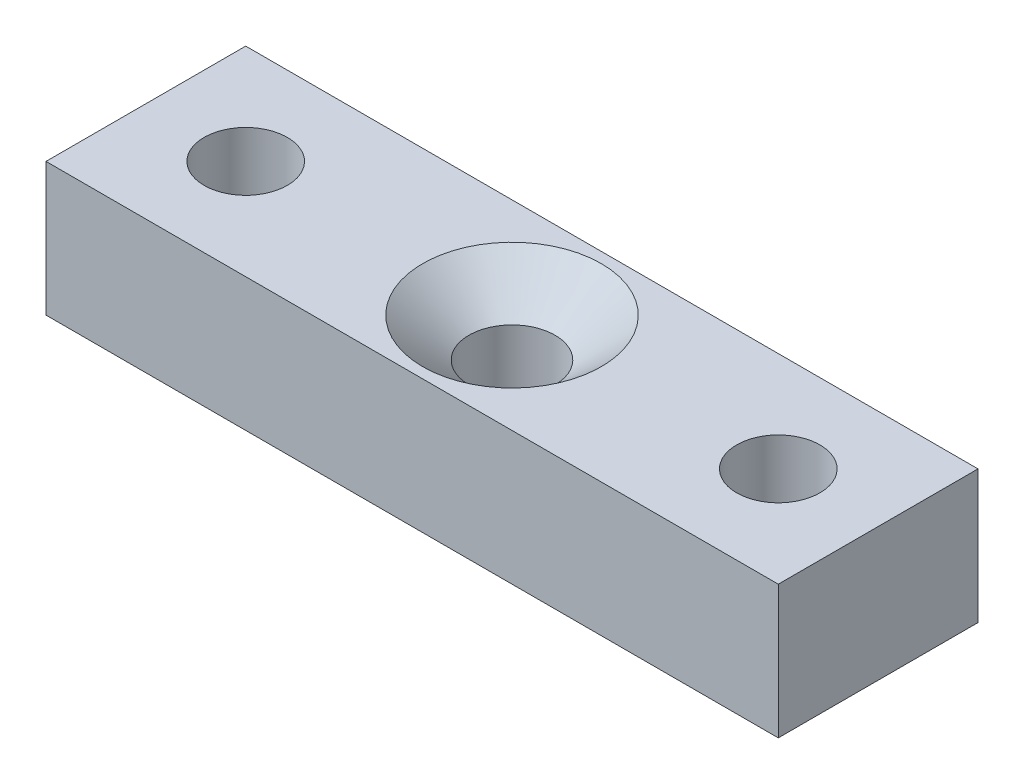
ISO-10303-21;
HEADER;
FILE_DESCRIPTION(('STEP AP214'),'2;1');
FILE_NAME('part.step','',(''),(''),'','','');
FILE_SCHEMA(('AUTOMOTIVE_DESIGN { 1 0 10303 214 1 1 1 1 }'));
ENDSEC;
DATA;
#1=APPLICATION_CONTEXT('core data for automotive mechanical design processes');
#2=APPLICATION_PROTOCOL_DEFINITION('international standard','automotive_design',2000,#1);
#3=PRODUCT_CONTEXT('',#1,'mechanical');
#4=PRODUCT('Part','Part','',(#3));
#5=PRODUCT_RELATED_PRODUCT_CATEGORY('part','',(#4));
#6=PRODUCT_DEFINITION_FORMATION('','',#4);
#7=PRODUCT_DEFINITION_CONTEXT('part definition',#1,'design');
#8=PRODUCT_DEFINITION('design','',#6,#7);
#9=PRODUCT_DEFINITION_SHAPE('','',#8);
#10=(LENGTH_UNIT() NAMED_UNIT(*) SI_UNIT(.MILLI.,.METRE.));
#11=(NAMED_UNIT(*) PLANE_ANGLE_UNIT() SI_UNIT($,.RADIAN.));
#12=(NAMED_UNIT(*) SI_UNIT($,.STERADIAN.) SOLID_ANGLE_UNIT());
#13=UNCERTAINTY_MEASURE_WITH_UNIT(LENGTH_MEASURE(1.E-05),#10,'distance_accuracy_value','');
#14=(GEOMETRIC_REPRESENTATION_CONTEXT(3) GLOBAL_UNCERTAINTY_ASSIGNED_CONTEXT((#13)) GLOBAL_UNIT_ASSIGNED_CONTEXT((#10,
#11,#12)) REPRESENTATION_CONTEXT('',''));
#15=CARTESIAN_POINT('',(0.,0.,0.));
#16=DIRECTION('',(0.,0.,1.));
#17=DIRECTION('',(1.,0.,0.));
#18=AXIS2_PLACEMENT_3D('',#15,#16,#17);
#19=CARTESIAN_POINT('',(34.925,-6.35,19.05));
#20=DIRECTION('',(-1.,0.,0.));
#21=DIRECTION('',(0.,0.,1.));
#22=AXIS2_PLACEMENT_3D('',#19,#20,#21);
#23=PLANE('',#22);
#24=DIRECTION('',(0.,1.,0.));
#25=VECTOR('',#24,1.);
#26=CARTESIAN_POINT('',(34.925,-6.35,0.));
#27=LINE('',#26,#25);
#28=CARTESIAN_POINT('',(34.925,-6.35,0.));
#29=VERTEX_POINT('',#28);
#30=CARTESIAN_POINT('',(34.925,6.35,0.));
#31=VERTEX_POINT('',#30);
#32=EDGE_CURVE('E98',#29,#31,#27,.T.);
#33=ORIENTED_EDGE('',*,*,#32,.T.);
#34=DIRECTION('',(0.,0.,-1.));
#35=VECTOR('',#34,1.);
#36=CARTESIAN_POINT('',(34.925,6.35,19.05));
#37=LINE('',#36,#35);
#38=CARTESIAN_POINT('',(34.925,6.35,19.05));
#39=VERTEX_POINT('',#38);
#40=EDGE_CURVE('E11',#39,#31,#37,.T.);
#41=ORIENTED_EDGE('',*,*,#40,.F.);
#42=DIRECTION('',(0.,1.,0.));
#43=VECTOR('',#42,1.);
#44=CARTESIAN_POINT('',(34.925,-6.35,19.05));
#45=LINE('',#44,#43);
#46=CARTESIAN_POINT('',(34.925,-6.35,19.05));
#47=VERTEX_POINT('',#46);
#48=EDGE_CURVE('E86',#47,#39,#45,.T.);
#49=ORIENTED_EDGE('',*,*,#48,.F.);
#50=DIRECTION('',(0.,0.,-1.));
#51=VECTOR('',#50,1.);
#52=CARTESIAN_POINT('',(34.925,-6.35,19.05));
#53=LINE('',#52,#51);
#54=EDGE_CURVE('E94',#47,#29,#53,.T.);
#55=ORIENTED_EDGE('',*,*,#54,.T.);
#56=EDGE_LOOP('',(#33,#41,#49,#55));
#57=FACE_BOUND('',#56,.T.);
#58=ADVANCED_FACE('F35',(#57),#23,.F.);
#59=CARTESIAN_POINT('',(-34.925,6.35,19.05));
#60=DIRECTION('',(0.,-1.,0.));
#61=DIRECTION('',(0.,0.,-1.));
#62=AXIS2_PLACEMENT_3D('',#59,#60,#61);
#63=PLANE('',#62);
#64=CARTESIAN_POINT('',(0.,6.35,9.525));
#65=DIRECTION('',(0.,1.,0.));
#66=DIRECTION('',(0.,0.,1.));
#67=AXIS2_PLACEMENT_3D('',#64,#65,#66);
#68=CIRCLE('',#67,8.5185631);
#69=CARTESIAN_POINT('',(0.,6.35,18.0435631));
#70=VERTEX_POINT('',#69);
#71=EDGE_CURVE('E129',#70,#70,#68,.T.);
#72=ORIENTED_EDGE('',*,*,#71,.F.);
#73=EDGE_LOOP('',(#72));
#74=FACE_BOUND('',#73,.T.);
#75=CARTESIAN_POINT('',(-25.4,6.35,9.525));
#76=DIRECTION('',(0.,1.,0.));
#77=DIRECTION('',(0.,0.,1.));
#78=AXIS2_PLACEMENT_3D('',#75,#76,#77);
#79=CIRCLE('',#78,3.96875);
#80=CARTESIAN_POINT('',(-25.4,6.35,13.49375));
#81=VERTEX_POINT('',#80);
#82=EDGE_CURVE('E120',#81,#81,#79,.T.);
#83=ORIENTED_EDGE('',*,*,#82,.F.);
#84=EDGE_LOOP('',(#83));
#85=FACE_BOUND('',#84,.T.);
#86=CARTESIAN_POINT('',(25.4,6.35,9.525));
#87=DIRECTION('',(0.,1.,0.));
#88=DIRECTION('',(0.,0.,1.));
#89=AXIS2_PLACEMENT_3D('',#86,#87,#88);
#90=CIRCLE('',#89,3.96875);
#91=CARTESIAN_POINT('',(25.4,6.35,13.49375));
#92=VERTEX_POINT('',#91);
#93=EDGE_CURVE('E114',#92,#92,#90,.T.);
#94=ORIENTED_EDGE('',*,*,#93,.F.);
#95=EDGE_LOOP('',(#94));
#96=FACE_BOUND('',#95,.T.);
#97=DIRECTION('',(-1.,0.,0.));
#98=VECTOR('',#97,1.);
#99=CARTESIAN_POINT('',(-34.925,6.35,0.));
#100=LINE('',#99,#98);
#101=CARTESIAN_POINT('',(-34.925,6.35,0.));
#102=VERTEX_POINT('',#101);
#103=EDGE_CURVE('E90',#31,#102,#100,.T.);
#104=ORIENTED_EDGE('',*,*,#103,.T.);
#105=DIRECTION('',(0.,0.,-1.));
#106=VECTOR('',#105,1.);
#107=CARTESIAN_POINT('',(-34.925,6.35,19.05));
#108=LINE('',#107,#106);
#109=CARTESIAN_POINT('',(-34.925,6.35,19.05));
#110=VERTEX_POINT('',#109);
#111=EDGE_CURVE('E43',#110,#102,#108,.T.);
#112=ORIENTED_EDGE('',*,*,#111,.F.);
#113=DIRECTION('',(-1.,0.,0.));
#114=VECTOR('',#113,1.);
#115=CARTESIAN_POINT('',(-34.925,6.35,19.05));
#116=LINE('',#115,#114);
#117=EDGE_CURVE('E81',#39,#110,#116,.T.);
#118=ORIENTED_EDGE('',*,*,#117,.F.);
#119=ORIENTED_EDGE('',*,*,#40,.T.);
#120=EDGE_LOOP('',(#104,#112,#118,#119));
#121=FACE_BOUND('',#120,.T.);
#122=ADVANCED_FACE('F89',(#74,#85,#96,#121),#63,.F.);
#123=CARTESIAN_POINT('',(-34.925,-6.35,19.05));
#124=DIRECTION('',(1.,0.,0.));
#125=DIRECTION('',(0.,0.,-1.));
#126=AXIS2_PLACEMENT_3D('',#123,#124,#125);
#127=PLANE('',#126);
#128=DIRECTION('',(0.,-1.,0.));
#129=VECTOR('',#128,1.);
#130=CARTESIAN_POINT('',(-34.925,-6.35,0.));
#131=LINE('',#130,#129);
#132=CARTESIAN_POINT('',(-34.925,-6.35,0.));
#133=VERTEX_POINT('',#132);
#134=EDGE_CURVE('E68',#102,#133,#131,.T.);
#135=ORIENTED_EDGE('',*,*,#134,.T.);
#136=DIRECTION('',(0.,0.,-1.));
#137=VECTOR('',#136,1.);
#138=CARTESIAN_POINT('',(-34.925,-6.35,19.05));
#139=LINE('',#138,#137);
#140=CARTESIAN_POINT('',(-34.925,-6.35,19.05));
#141=VERTEX_POINT('',#140);
#142=EDGE_CURVE('E91',#141,#133,#139,.T.);
#143=ORIENTED_EDGE('',*,*,#142,.F.);
#144=DIRECTION('',(0.,-1.,0.));
#145=VECTOR('',#144,1.);
#146=CARTESIAN_POINT('',(-34.925,-6.35,19.05));
#147=LINE('',#146,#145);
#148=EDGE_CURVE('E84',#110,#141,#147,.T.);
#149=ORIENTED_EDGE('',*,*,#148,.F.);
#150=ORIENTED_EDGE('',*,*,#111,.T.);
#151=EDGE_LOOP('',(#135,#143,#149,#150));
#152=FACE_BOUND('',#151,.T.);
#153=ADVANCED_FACE('F92',(#152),#127,.F.);
#154=CARTESIAN_POINT('',(-34.925,-6.35,19.05));
#155=DIRECTION('',(0.,1.,0.));
#156=DIRECTION('',(0.,0.,1.));
#157=AXIS2_PLACEMENT_3D('',#154,#155,#156);
#158=PLANE('',#157);
#159=CARTESIAN_POINT('',(0.,-6.35,9.525));
#160=DIRECTION('',(0.,1.,0.));
#161=DIRECTION('',(0.,0.,1.));
#162=AXIS2_PLACEMENT_3D('',#159,#160,#161);
#163=CIRCLE('',#162,4.1021);
#164=CARTESIAN_POINT('',(0.,-6.35,13.6271));
#165=VERTEX_POINT('',#164);
#166=EDGE_CURVE('E123',#165,#165,#163,.T.);
#167=ORIENTED_EDGE('',*,*,#166,.T.);
#168=EDGE_LOOP('',(#167));
#169=FACE_BOUND('',#168,.T.);
#170=CARTESIAN_POINT('',(-25.4,-6.35,9.525));
#171=DIRECTION('',(0.,1.,0.));
#172=DIRECTION('',(0.,0.,1.));
#173=AXIS2_PLACEMENT_3D('',#170,#171,#172);
#174=CIRCLE('',#173,3.96875);
#175=CARTESIAN_POINT('',(-25.4,-6.35,13.49375));
#176=VERTEX_POINT('',#175);
#177=EDGE_CURVE('E117',#176,#176,#174,.T.);
#178=ORIENTED_EDGE('',*,*,#177,.T.);
#179=EDGE_LOOP('',(#178));
#180=FACE_BOUND('',#179,.T.);
#181=CARTESIAN_POINT('',(25.4,-6.35,9.525));
#182=DIRECTION('',(0.,1.,0.));
#183=DIRECTION('',(0.,0.,1.));
#184=AXIS2_PLACEMENT_3D('',#181,#182,#183);
#185=CIRCLE('',#184,3.96875);
#186=CARTESIAN_POINT('',(25.4,-6.35,13.49375));
#187=VERTEX_POINT('',#186);
#188=EDGE_CURVE('E101',#187,#187,#185,.T.);
#189=ORIENTED_EDGE('',*,*,#188,.T.);
#190=EDGE_LOOP('',(#189));
#191=FACE_BOUND('',#190,.T.);
#192=DIRECTION('',(1.,0.,0.));
#193=VECTOR('',#192,1.);
#194=CARTESIAN_POINT('',(-34.925,-6.35,0.));
#195=LINE('',#194,#193);
#196=EDGE_CURVE('E74',#133,#29,#195,.T.);
#197=ORIENTED_EDGE('',*,*,#196,.T.);
#198=ORIENTED_EDGE('',*,*,#54,.F.);
#199=DIRECTION('',(1.,0.,0.));
#200=VECTOR('',#199,1.);
#201=CARTESIAN_POINT('',(-34.925,-6.35,19.05));
#202=LINE('',#201,#200);
#203=EDGE_CURVE('E51',#141,#47,#202,.T.);
#204=ORIENTED_EDGE('',*,*,#203,.F.);
#205=ORIENTED_EDGE('',*,*,#142,.T.);
#206=EDGE_LOOP('',(#197,#198,#204,#205));
#207=FACE_BOUND('',#206,.T.);
#208=ADVANCED_FACE('F106',(#169,#180,#191,#207),#158,.F.);
#209=CARTESIAN_POINT('',(0.,0.,19.05));
#210=DIRECTION('',(0.,0.,-1.));
#211=DIRECTION('',(-1.,0.,0.));
#212=AXIS2_PLACEMENT_3D('',#209,#210,#211);
#213=PLANE('',#212);
#214=ORIENTED_EDGE('',*,*,#48,.T.);
#215=ORIENTED_EDGE('',*,*,#117,.T.);
#216=ORIENTED_EDGE('',*,*,#148,.T.);
#217=ORIENTED_EDGE('',*,*,#203,.T.);
#218=EDGE_LOOP('',(#214,#215,#216,#217));
#219=FACE_BOUND('',#218,.T.);
#220=ADVANCED_FACE('F82',(#219),#213,.F.);
#221=CARTESIAN_POINT('',(0.,0.,0.));
#222=DIRECTION('',(0.,0.,-1.));
#223=DIRECTION('',(-1.,0.,0.));
#224=AXIS2_PLACEMENT_3D('',#221,#222,#223);
#225=PLANE('',#224);
#226=ORIENTED_EDGE('',*,*,#32,.F.);
#227=ORIENTED_EDGE('',*,*,#196,.F.);
#228=ORIENTED_EDGE('',*,*,#134,.F.);
#229=ORIENTED_EDGE('',*,*,#103,.F.);
#230=EDGE_LOOP('',(#226,#227,#228,#229));
#231=FACE_BOUND('',#230,.T.);
#232=ADVANCED_FACE('F109',(#231),#225,.T.);
#233=CARTESIAN_POINT('',(25.4,6.35,9.525));
#234=DIRECTION('',(0.,1.,0.));
#235=DIRECTION('',(0.,0.,1.));
#236=AXIS2_PLACEMENT_3D('',#233,#234,#235);
#237=CYLINDRICAL_SURFACE('',#236,3.96875);
#238=ORIENTED_EDGE('',*,*,#188,.F.);
#239=EDGE_LOOP('',(#238));
#240=FACE_BOUND('',#239,.T.);
#241=ORIENTED_EDGE('',*,*,#93,.T.);
#242=EDGE_LOOP('',(#241));
#243=FACE_BOUND('',#242,.T.);
#244=ADVANCED_FACE('F141',(#240,#243),#237,.F.);
#245=CARTESIAN_POINT('',(-25.4,6.35,9.525));
#246=DIRECTION('',(0.,1.,0.));
#247=DIRECTION('',(0.,0.,1.));
#248=AXIS2_PLACEMENT_3D('',#245,#246,#247);
#249=CYLINDRICAL_SURFACE('',#248,3.96875);
#250=ORIENTED_EDGE('',*,*,#177,.F.);
#251=EDGE_LOOP('',(#250));
#252=FACE_BOUND('',#251,.T.);
#253=ORIENTED_EDGE('',*,*,#82,.T.);
#254=EDGE_LOOP('',(#253));
#255=FACE_BOUND('',#254,.T.);
#256=ADVANCED_FACE('F143',(#252,#255),#249,.F.);
#257=CARTESIAN_POINT('',(0.,6.35,9.525));
#258=DIRECTION('',(0.,1.,0.));
#259=DIRECTION('',(0.,0.,1.));
#260=AXIS2_PLACEMENT_3D('',#257,#258,#259);
#261=CYLINDRICAL_SURFACE('',#260,4.1021);
#262=ORIENTED_EDGE('',*,*,#166,.F.);
#263=EDGE_LOOP('',(#262));
#264=FACE_BOUND('',#263,.T.);
#265=CARTESIAN_POINT('',(0.,2.64414744168193,9.525));
#266=DIRECTION('',(0.,1.,0.));
#267=DIRECTION('',(0.,0.,1.));
#268=AXIS2_PLACEMENT_3D('',#265,#266,#267);
#269=CIRCLE('',#268,4.1021);
#270=CARTESIAN_POINT('',(0.,2.64414744168193,13.6271));
#271=VERTEX_POINT('',#270);
#272=EDGE_CURVE('E126',#271,#271,#269,.T.);
#273=ORIENTED_EDGE('',*,*,#272,.T.);
#274=EDGE_LOOP('',(#273));
#275=FACE_BOUND('',#274,.T.);
#276=ADVANCED_FACE('F150',(#264,#275),#261,.F.);
#277=CARTESIAN_POINT('',(0.,6.35,9.525));
#278=DIRECTION('',(0.,1.,0.));
#279=DIRECTION('',(0.,0.,1.));
#280=AXIS2_PLACEMENT_3D('',#277,#278,#279);
#281=CONICAL_SURFACE('',#280,8.5185631,0.872664625997165);
#282=ORIENTED_EDGE('',*,*,#272,.F.);
#283=EDGE_LOOP('',(#282));
#284=FACE_BOUND('',#283,.T.);
#285=ORIENTED_EDGE('',*,*,#71,.T.);
#286=EDGE_LOOP('',(#285));
#287=FACE_BOUND('',#286,.T.);
#288=ADVANCED_FACE('F133',(#284,#287),#281,.F.);
#289=CLOSED_SHELL('',(#58,#122,#153,#208,#220,#232,#244,#256,#276,#288));
#290=MANIFOLD_SOLID_BREP('B2',#289);
#291=ADVANCED_BREP_SHAPE_REPRESENTATION('',(#18,#290),#14);
#292=SHAPE_DEFINITION_REPRESENTATION(#9,#291);
ENDSEC;
END-ISO-10303-21;
